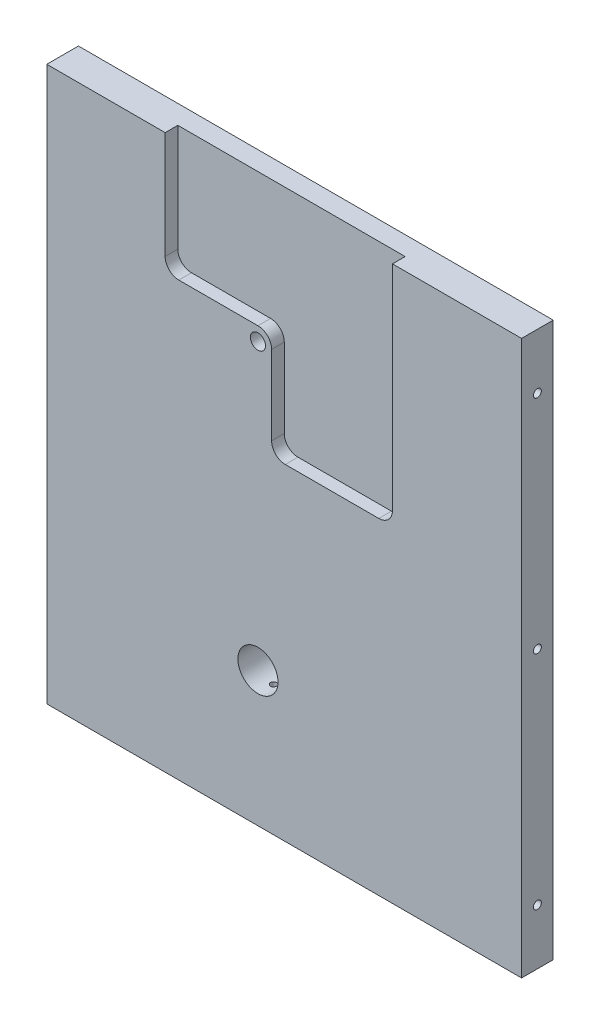
ISO-10303-21;
HEADER;
FILE_DESCRIPTION(('STEP AP214'),'2;1');
FILE_NAME('part.step','',(''),(''),'','','');
FILE_SCHEMA(('AUTOMOTIVE_DESIGN { 1 0 10303 214 1 1 1 1 }'));
ENDSEC;
DATA;
#1=APPLICATION_CONTEXT('core data for automotive mechanical design processes');
#2=APPLICATION_PROTOCOL_DEFINITION('international standard','automotive_design',2000,#1);
#3=PRODUCT_CONTEXT('',#1,'mechanical');
#4=PRODUCT('Part','Part','',(#3));
#5=PRODUCT_RELATED_PRODUCT_CATEGORY('part','',(#4));
#6=PRODUCT_DEFINITION_FORMATION('','',#4);
#7=PRODUCT_DEFINITION_CONTEXT('part definition',#1,'design');
#8=PRODUCT_DEFINITION('design','',#6,#7);
#9=PRODUCT_DEFINITION_SHAPE('','',#8);
#10=(LENGTH_UNIT() NAMED_UNIT(*) SI_UNIT(.MILLI.,.METRE.));
#11=(NAMED_UNIT(*) PLANE_ANGLE_UNIT() SI_UNIT($,.RADIAN.));
#12=(NAMED_UNIT(*) SI_UNIT($,.STERADIAN.) SOLID_ANGLE_UNIT());
#13=UNCERTAINTY_MEASURE_WITH_UNIT(LENGTH_MEASURE(1.E-05),#10,'distance_accuracy_value','');
#14=(GEOMETRIC_REPRESENTATION_CONTEXT(3) GLOBAL_UNCERTAINTY_ASSIGNED_CONTEXT((#13)) GLOBAL_UNIT_ASSIGNED_CONTEXT((#10,
#11,#12)) REPRESENTATION_CONTEXT('',''));
#15=CARTESIAN_POINT('',(0.,0.,0.));
#16=DIRECTION('',(0.,0.,1.));
#17=DIRECTION('',(1.,0.,0.));
#18=AXIS2_PLACEMENT_3D('',#15,#16,#17);
#19=CARTESIAN_POINT('',(-96.1409476965305,69.4002341533426,10.));
#20=DIRECTION('',(1.,0.,0.));
#21=DIRECTION('',(0.,1.,0.));
#22=AXIS2_PLACEMENT_3D('',#19,#20,#21);
#23=PLANE('',#22);
#24=CARTESIAN_POINT('',(-96.1409476965305,51.9002341533426,4.99999999999999));
#25=DIRECTION('',(-1.,0.,0.));
#26=DIRECTION('',(0.,-1.,0.));
#27=AXIS2_PLACEMENT_3D('',#24,#25,#26);
#28=CIRCLE('',#27,1.25);
#29=CARTESIAN_POINT('',(-96.1409476965305,50.6502341533426,4.99999999999999));
#30=VERTEX_POINT('',#29);
#31=EDGE_CURVE('E327',#30,#30,#28,.T.);
#32=ORIENTED_EDGE('',*,*,#31,.F.);
#33=EDGE_LOOP('',(#32));
#34=FACE_BOUND('',#33,.T.);
#35=CARTESIAN_POINT('',(-96.1409476965304,-18.0997658466574,5.));
#36=DIRECTION('',(-1.,0.,0.));
#37=DIRECTION('',(0.,-1.,0.));
#38=AXIS2_PLACEMENT_3D('',#35,#36,#37);
#39=CIRCLE('',#38,1.25);
#40=CARTESIAN_POINT('',(-96.1409476965304,-19.3497658466574,5.));
#41=VERTEX_POINT('',#40);
#42=EDGE_CURVE('E331',#41,#41,#39,.T.);
#43=ORIENTED_EDGE('',*,*,#42,.F.);
#44=EDGE_LOOP('',(#43));
#45=FACE_BOUND('',#44,.T.);
#46=CARTESIAN_POINT('',(-96.1409476965304,-88.0997658466574,4.99999999999999));
#47=DIRECTION('',(-1.,0.,0.));
#48=DIRECTION('',(0.,-1.,0.));
#49=AXIS2_PLACEMENT_3D('',#46,#47,#48);
#50=CIRCLE('',#49,1.25);
#51=CARTESIAN_POINT('',(-96.1409476965304,-89.3497658466574,4.99999999999999));
#52=VERTEX_POINT('',#51);
#53=EDGE_CURVE('E174',#52,#52,#50,.T.);
#54=ORIENTED_EDGE('',*,*,#53,.F.);
#55=EDGE_LOOP('',(#54));
#56=FACE_BOUND('',#55,.T.);
#57=DIRECTION('',(0.,-1.,0.));
#58=VECTOR('',#57,1.);
#59=CARTESIAN_POINT('',(-96.1409476965305,69.4002341533426,0.));
#60=LINE('',#59,#58);
#61=CARTESIAN_POINT('',(-96.1409476965305,69.4002341533426,0.));
#62=VERTEX_POINT('',#61);
#63=CARTESIAN_POINT('',(-96.1409476965304,-105.599765846657,0.));
#64=VERTEX_POINT('',#63);
#65=EDGE_CURVE('E238',#62,#64,#60,.T.);
#66=ORIENTED_EDGE('',*,*,#65,.T.);
#67=DIRECTION('',(0.,0.,-1.));
#68=VECTOR('',#67,1.);
#69=CARTESIAN_POINT('',(-96.1409476965304,-105.599765846657,10.));
#70=LINE('',#69,#68);
#71=CARTESIAN_POINT('',(-96.1409476965304,-105.599765846657,10.));
#72=VERTEX_POINT('',#71);
#73=EDGE_CURVE('E11',#72,#64,#70,.T.);
#74=ORIENTED_EDGE('',*,*,#73,.F.);
#75=DIRECTION('',(0.,-1.,0.));
#76=VECTOR('',#75,1.);
#77=CARTESIAN_POINT('',(-96.1409476965305,69.4002341533426,10.));
#78=LINE('',#77,#76);
#79=CARTESIAN_POINT('',(-96.1409476965305,69.4002341533426,10.));
#80=VERTEX_POINT('',#79);
#81=EDGE_CURVE('E247',#80,#72,#78,.T.);
#82=ORIENTED_EDGE('',*,*,#81,.F.);
#83=DIRECTION('',(0.,0.,-1.));
#84=VECTOR('',#83,1.);
#85=CARTESIAN_POINT('',(-96.1409476965305,69.4002341533426,10.));
#86=LINE('',#85,#84);
#87=EDGE_CURVE('E255',#80,#62,#86,.T.);
#88=ORIENTED_EDGE('',*,*,#87,.T.);
#89=EDGE_LOOP('',(#66,#74,#82,#88));
#90=FACE_BOUND('',#89,.T.);
#91=ADVANCED_FACE('F32',(#34,#45,#56,#90),#23,.F.);
#92=CARTESIAN_POINT('',(-96.1409476965304,-105.599765846657,10.));
#93=DIRECTION('',(0.,1.,0.));
#94=DIRECTION('',(0.,0.,1.));
#95=AXIS2_PLACEMENT_3D('',#92,#93,#94);
#96=PLANE('',#95);
#97=CARTESIAN_POINT('',(-29.4209476965304,-105.599765846657,5.));
#98=DIRECTION('',(0.,-1.,0.));
#99=DIRECTION('',(0.,0.,-1.));
#100=AXIS2_PLACEMENT_3D('',#97,#98,#99);
#101=CIRCLE('',#100,0.999999999999998);
#102=CARTESIAN_POINT('',(-29.4209476965304,-105.599765846657,4.));
#103=VERTEX_POINT('',#102);
#104=EDGE_CURVE('E347',#103,#103,#101,.T.);
#105=ORIENTED_EDGE('',*,*,#104,.F.);
#106=EDGE_LOOP('',(#105));
#107=FACE_BOUND('',#106,.T.);
#108=DIRECTION('',(1.,0.,0.));
#109=VECTOR('',#108,1.);
#110=CARTESIAN_POINT('',(-96.1409476965304,-105.599765846657,0.));
#111=LINE('',#110,#109);
#112=CARTESIAN_POINT('',(53.8590523034696,-105.599765846657,0.));
#113=VERTEX_POINT('',#112);
#114=EDGE_CURVE('E258',#64,#113,#111,.T.);
#115=ORIENTED_EDGE('',*,*,#114,.T.);
#116=DIRECTION('',(0.,0.,-1.));
#117=VECTOR('',#116,1.);
#118=CARTESIAN_POINT('',(53.8590523034696,-105.599765846657,10.));
#119=LINE('',#118,#117);
#120=CARTESIAN_POINT('',(53.8590523034696,-105.599765846657,10.));
#121=VERTEX_POINT('',#120);
#122=EDGE_CURVE('E45',#121,#113,#119,.T.);
#123=ORIENTED_EDGE('',*,*,#122,.F.);
#124=DIRECTION('',(1.,0.,0.));
#125=VECTOR('',#124,1.);
#126=CARTESIAN_POINT('',(-96.1409476965304,-105.599765846657,10.));
#127=LINE('',#126,#125);
#128=EDGE_CURVE('E90',#72,#121,#127,.T.);
#129=ORIENTED_EDGE('',*,*,#128,.F.);
#130=ORIENTED_EDGE('',*,*,#73,.T.);
#131=EDGE_LOOP('',(#115,#123,#129,#130));
#132=FACE_BOUND('',#131,.T.);
#133=ADVANCED_FACE('F318',(#107,#132),#96,.F.);
#134=CARTESIAN_POINT('',(53.8590523034695,69.4002341533426,10.));
#135=DIRECTION('',(-1.,0.,0.));
#136=DIRECTION('',(0.,-1.,0.));
#137=AXIS2_PLACEMENT_3D('',#134,#135,#136);
#138=PLANE('',#137);
#139=CARTESIAN_POINT('',(53.8590523034695,51.9002341533426,5.));
#140=DIRECTION('',(1.,0.,0.));
#141=DIRECTION('',(0.,1.,0.));
#142=AXIS2_PLACEMENT_3D('',#139,#140,#141);
#143=CIRCLE('',#142,1.25);
#144=CARTESIAN_POINT('',(53.8590523034695,53.1502341533426,5.));
#145=VERTEX_POINT('',#144);
#146=EDGE_CURVE('E339',#145,#145,#143,.T.);
#147=ORIENTED_EDGE('',*,*,#146,.F.);
#148=EDGE_LOOP('',(#147));
#149=FACE_BOUND('',#148,.T.);
#150=CARTESIAN_POINT('',(53.8590523034695,-18.0997658466574,5.));
#151=DIRECTION('',(1.,0.,0.));
#152=DIRECTION('',(0.,1.,0.));
#153=AXIS2_PLACEMENT_3D('',#150,#151,#152);
#154=CIRCLE('',#153,1.25);
#155=CARTESIAN_POINT('',(53.8590523034695,-16.8497658466574,5.));
#156=VERTEX_POINT('',#155);
#157=EDGE_CURVE('E351',#156,#156,#154,.T.);
#158=ORIENTED_EDGE('',*,*,#157,.F.);
#159=EDGE_LOOP('',(#158));
#160=FACE_BOUND('',#159,.T.);
#161=CARTESIAN_POINT('',(53.8590523034696,-88.0997658466574,5.));
#162=DIRECTION('',(1.,0.,0.));
#163=DIRECTION('',(0.,1.,0.));
#164=AXIS2_PLACEMENT_3D('',#161,#162,#163);
#165=CIRCLE('',#164,1.25);
#166=CARTESIAN_POINT('',(53.8590523034696,-86.8497658466574,5.));
#167=VERTEX_POINT('',#166);
#168=EDGE_CURVE('E357',#167,#167,#165,.T.);
#169=ORIENTED_EDGE('',*,*,#168,.F.);
#170=EDGE_LOOP('',(#169));
#171=FACE_BOUND('',#170,.T.);
#172=DIRECTION('',(0.,1.,0.));
#173=VECTOR('',#172,1.);
#174=CARTESIAN_POINT('',(53.8590523034695,69.4002341533426,0.));
#175=LINE('',#174,#173);
#176=CARTESIAN_POINT('',(53.8590523034695,69.4002341533426,0.));
#177=VERTEX_POINT('',#176);
#178=EDGE_CURVE('E260',#113,#177,#175,.T.);
#179=ORIENTED_EDGE('',*,*,#178,.T.);
#180=DIRECTION('',(0.,0.,-1.));
#181=VECTOR('',#180,1.);
#182=CARTESIAN_POINT('',(53.8590523034695,69.4002341533426,10.));
#183=LINE('',#182,#181);
#184=CARTESIAN_POINT('',(53.8590523034695,69.4002341533426,10.));
#185=VERTEX_POINT('',#184);
#186=EDGE_CURVE('E264',#185,#177,#183,.T.);
#187=ORIENTED_EDGE('',*,*,#186,.F.);
#188=DIRECTION('',(0.,1.,0.));
#189=VECTOR('',#188,1.);
#190=CARTESIAN_POINT('',(53.8590523034695,69.4002341533426,10.));
#191=LINE('',#190,#189);
#192=EDGE_CURVE('E250',#121,#185,#191,.T.);
#193=ORIENTED_EDGE('',*,*,#192,.F.);
#194=ORIENTED_EDGE('',*,*,#122,.T.);
#195=EDGE_LOOP('',(#179,#187,#193,#194));
#196=FACE_BOUND('',#195,.T.);
#197=ADVANCED_FACE('F270',(#149,#160,#171,#196),#138,.F.);
#198=CARTESIAN_POINT('',(-96.1409476965305,69.4002341533426,10.));
#199=DIRECTION('',(0.,-1.,0.));
#200=DIRECTION('',(0.,0.,-1.));
#201=AXIS2_PLACEMENT_3D('',#198,#199,#200);
#202=PLANE('',#201);
#203=DIRECTION('',(-1.,0.,0.));
#204=VECTOR('',#203,1.);
#205=CARTESIAN_POINT('',(-96.1409476965305,69.4002341533426,10.));
#206=LINE('',#205,#204);
#207=CARTESIAN_POINT('',(-58.7437041134573,69.4002341533426,10.));
#208=VERTEX_POINT('',#207);
#209=EDGE_CURVE('E61',#208,#80,#206,.T.);
#210=ORIENTED_EDGE('',*,*,#209,.F.);
#211=DIRECTION('',(0.,0.,1.));
#212=VECTOR('',#211,1.);
#213=CARTESIAN_POINT('',(-58.7437041134573,69.4002341533426,6.));
#214=LINE('',#213,#212);
#215=CARTESIAN_POINT('',(-58.7437041134573,69.4002341533426,6.));
#216=VERTEX_POINT('',#215);
#217=EDGE_CURVE('E219',#216,#208,#214,.T.);
#218=ORIENTED_EDGE('',*,*,#217,.F.);
#219=DIRECTION('',(-1.,0.,0.));
#220=VECTOR('',#219,1.);
#221=CARTESIAN_POINT('',(-58.7437041134573,69.4002341533426,6.));
#222=LINE('',#221,#220);
#223=CARTESIAN_POINT('',(13.0742958865426,69.4002341533426,6.));
#224=VERTEX_POINT('',#223);
#225=EDGE_CURVE('E193',#224,#216,#222,.T.);
#226=ORIENTED_EDGE('',*,*,#225,.F.);
#227=DIRECTION('',(0.,0.,1.));
#228=VECTOR('',#227,1.);
#229=CARTESIAN_POINT('',(13.0742958865426,69.4002341533426,6.));
#230=LINE('',#229,#228);
#231=CARTESIAN_POINT('',(13.0742958865426,69.4002341533426,10.));
#232=VERTEX_POINT('',#231);
#233=EDGE_CURVE('E221',#224,#232,#230,.T.);
#234=ORIENTED_EDGE('',*,*,#233,.T.);
#235=EDGE_CURVE('E252',#185,#232,#206,.T.);
#236=ORIENTED_EDGE('',*,*,#235,.F.);
#237=ORIENTED_EDGE('',*,*,#186,.T.);
#238=DIRECTION('',(-1.,0.,0.));
#239=VECTOR('',#238,1.);
#240=CARTESIAN_POINT('',(-96.1409476965305,69.4002341533426,0.));
#241=LINE('',#240,#239);
#242=EDGE_CURVE('E83',#177,#62,#241,.T.);
#243=ORIENTED_EDGE('',*,*,#242,.T.);
#244=ORIENTED_EDGE('',*,*,#87,.F.);
#245=EDGE_LOOP('',(#210,#218,#226,#234,#236,#237,#243,#244));
#246=FACE_BOUND('',#245,.T.);
#247=ADVANCED_FACE('F278',(#246),#202,.F.);
#248=CARTESIAN_POINT('',(0.,0.,10.));
#249=DIRECTION('',(0.,0.,1.));
#250=DIRECTION('',(1.,0.,0.));
#251=AXIS2_PLACEMENT_3D('',#248,#249,#250);
#252=PLANE('',#251);
#253=DIRECTION('',(0.,-1.,0.));
#254=VECTOR('',#253,1.);
#255=CARTESIAN_POINT('',(-58.7437041134574,35.5362341533427,10.));
#256=LINE('',#255,#254);
#257=CARTESIAN_POINT('',(-58.7437041134574,35.5362341533427,10.));
#258=VERTEX_POINT('',#257);
#259=EDGE_CURVE('E168',#208,#258,#256,.T.);
#260=ORIENTED_EDGE('',*,*,#259,.F.);
#261=ORIENTED_EDGE('',*,*,#209,.T.);
#262=ORIENTED_EDGE('',*,*,#81,.T.);
#263=ORIENTED_EDGE('',*,*,#128,.T.);
#264=ORIENTED_EDGE('',*,*,#192,.T.);
#265=ORIENTED_EDGE('',*,*,#235,.T.);
#266=DIRECTION('',(0.,1.,0.));
#267=VECTOR('',#266,1.);
#268=CARTESIAN_POINT('',(13.0742958865426,1.90023415334267,10.));
#269=LINE('',#268,#267);
#270=CARTESIAN_POINT('',(13.0742958865426,1.90023415334267,10.));
#271=VERTEX_POINT('',#270);
#272=EDGE_CURVE('E171',#271,#232,#269,.T.);
#273=ORIENTED_EDGE('',*,*,#272,.F.);
#274=CARTESIAN_POINT('',(8.75629588654262,1.90023415334267,10.));
#275=DIRECTION('',(0.,0.,1.));
#276=DIRECTION('',(1.,0.,0.));
#277=AXIS2_PLACEMENT_3D('',#274,#275,#276);
#278=CIRCLE('',#277,4.318);
#279=CARTESIAN_POINT('',(8.75629588654262,-2.41776584665733,10.));
#280=VERTEX_POINT('',#279);
#281=EDGE_CURVE('E212',#280,#271,#278,.T.);
#282=ORIENTED_EDGE('',*,*,#281,.F.);
#283=DIRECTION('',(1.,0.,0.));
#284=VECTOR('',#283,1.);
#285=CARTESIAN_POINT('',(-20.7897041134574,-2.41776584665733,10.));
#286=LINE('',#285,#284);
#287=CARTESIAN_POINT('',(-20.7897041134574,-2.41776584665733,10.));
#288=VERTEX_POINT('',#287);
#289=EDGE_CURVE('E209',#288,#280,#286,.T.);
#290=ORIENTED_EDGE('',*,*,#289,.F.);
#291=CARTESIAN_POINT('',(-20.7897041134574,1.90023415334267,10.));
#292=DIRECTION('',(0.,0.,1.));
#293=DIRECTION('',(1.,0.,0.));
#294=AXIS2_PLACEMENT_3D('',#291,#292,#293);
#295=CIRCLE('',#294,4.318);
#296=CARTESIAN_POINT('',(-25.1077041134573,1.90023415334267,10.));
#297=VERTEX_POINT('',#296);
#298=EDGE_CURVE('E206',#297,#288,#295,.T.);
#299=ORIENTED_EDGE('',*,*,#298,.F.);
#300=DIRECTION('',(0.,-1.,0.));
#301=VECTOR('',#300,1.);
#302=CARTESIAN_POINT('',(-25.1077041134574,26.9002341533427,10.));
#303=LINE('',#302,#301);
#304=CARTESIAN_POINT('',(-25.1077041134574,26.9002341533427,10.));
#305=VERTEX_POINT('',#304);
#306=EDGE_CURVE('E203',#305,#297,#303,.T.);
#307=ORIENTED_EDGE('',*,*,#306,.F.);
#308=CARTESIAN_POINT('',(-29.4257041134573,26.9002341533427,10.));
#309=DIRECTION('',(0.,0.,-1.));
#310=DIRECTION('',(-1.,0.,0.));
#311=AXIS2_PLACEMENT_3D('',#308,#309,#310);
#312=CIRCLE('',#311,4.318);
#313=CARTESIAN_POINT('',(-29.4257041134573,31.2182341533427,10.));
#314=VERTEX_POINT('',#313);
#315=EDGE_CURVE('E200',#314,#305,#312,.T.);
#316=ORIENTED_EDGE('',*,*,#315,.F.);
#317=DIRECTION('',(1.,0.,0.));
#318=VECTOR('',#317,1.);
#319=CARTESIAN_POINT('',(-54.4257041134573,31.2182341533427,10.));
#320=LINE('',#319,#318);
#321=CARTESIAN_POINT('',(-54.4257041134573,31.2182341533427,10.));
#322=VERTEX_POINT('',#321);
#323=EDGE_CURVE('E197',#322,#314,#320,.T.);
#324=ORIENTED_EDGE('',*,*,#323,.F.);
#325=CARTESIAN_POINT('',(-54.4257041134573,35.5362341533427,10.));
#326=DIRECTION('',(0.,0.,1.));
#327=DIRECTION('',(-1.,0.,0.));
#328=AXIS2_PLACEMENT_3D('',#325,#326,#327);
#329=CIRCLE('',#328,4.318);
#330=EDGE_CURVE('E52',#258,#322,#329,.T.);
#331=ORIENTED_EDGE('',*,*,#330,.F.);
#332=EDGE_LOOP('',(#260,#261,#262,#263,#264,#265,#273,#282,#290,#299,#307,#316,#324,#331));
#333=FACE_BOUND('',#332,.T.);
#334=CARTESIAN_POINT('',(-29.4257041134573,26.9002341533427,10.));
#335=DIRECTION('',(0.,0.,1.));
#336=DIRECTION('',(1.,0.,0.));
#337=AXIS2_PLACEMENT_3D('',#334,#335,#336);
#338=CIRCLE('',#337,2.3876);
#339=CARTESIAN_POINT('',(-27.0381041134574,26.9002341533427,10.));
#340=VERTEX_POINT('',#339);
#341=EDGE_CURVE('E239',#340,#340,#338,.T.);
#342=ORIENTED_EDGE('',*,*,#341,.F.);
#343=EDGE_LOOP('',(#342));
#344=FACE_BOUND('',#343,.T.);
#345=CARTESIAN_POINT('',(-29.4257041134573,-63.0997658466573,10.));
#346=DIRECTION('',(0.,0.,1.));
#347=DIRECTION('',(1.,0.,0.));
#348=AXIS2_PLACEMENT_3D('',#345,#346,#347);
#349=CIRCLE('',#348,6.335);
#350=CARTESIAN_POINT('',(-23.0907041134574,-63.0997658466573,10.));
#351=VERTEX_POINT('',#350);
#352=EDGE_CURVE('E218',#351,#351,#349,.T.);
#353=ORIENTED_EDGE('',*,*,#352,.F.);
#354=EDGE_LOOP('',(#353));
#355=FACE_BOUND('',#354,.T.);
#356=ADVANCED_FACE('F283',(#333,#344,#355),#252,.T.);
#357=CARTESIAN_POINT('',(0.,0.,0.));
#358=DIRECTION('',(0.,0.,1.));
#359=DIRECTION('',(1.,0.,0.));
#360=AXIS2_PLACEMENT_3D('',#357,#358,#359);
#361=PLANE('',#360);
#362=CARTESIAN_POINT('',(-29.4257041134573,26.9002341533427,0.));
#363=DIRECTION('',(0.,0.,1.));
#364=DIRECTION('',(1.,0.,0.));
#365=AXIS2_PLACEMENT_3D('',#362,#363,#364);
#366=CIRCLE('',#365,2.3876);
#367=CARTESIAN_POINT('',(-27.0381041134574,26.9002341533427,0.));
#368=VERTEX_POINT('',#367);
#369=EDGE_CURVE('E235',#368,#368,#366,.T.);
#370=ORIENTED_EDGE('',*,*,#369,.T.);
#371=EDGE_LOOP('',(#370));
#372=FACE_BOUND('',#371,.T.);
#373=CARTESIAN_POINT('',(-29.4257041134573,-63.0997658466573,0.));
#374=DIRECTION('',(0.,0.,1.));
#375=DIRECTION('',(1.,0.,0.));
#376=AXIS2_PLACEMENT_3D('',#373,#374,#375);
#377=CIRCLE('',#376,6.335);
#378=CARTESIAN_POINT('',(-23.0907041134574,-63.0997658466573,0.));
#379=VERTEX_POINT('',#378);
#380=EDGE_CURVE('E242',#379,#379,#377,.T.);
#381=ORIENTED_EDGE('',*,*,#380,.T.);
#382=EDGE_LOOP('',(#381));
#383=FACE_BOUND('',#382,.T.);
#384=ORIENTED_EDGE('',*,*,#65,.F.);
#385=ORIENTED_EDGE('',*,*,#242,.F.);
#386=ORIENTED_EDGE('',*,*,#178,.F.);
#387=ORIENTED_EDGE('',*,*,#114,.F.);
#388=EDGE_LOOP('',(#384,#385,#386,#387));
#389=FACE_BOUND('',#388,.T.);
#390=ADVANCED_FACE('F274',(#372,#383,#389),#361,.F.);
#391=CARTESIAN_POINT('',(-29.4257041134573,-63.0997658466573,0.));
#392=DIRECTION('',(0.,0.,1.));
#393=DIRECTION('',(1.,0.,0.));
#394=AXIS2_PLACEMENT_3D('',#391,#392,#393);
#395=CYLINDRICAL_SURFACE('',#394,6.335);
#396=CARTESIAN_POINT('',(-29.4209476965304,-69.434764061061,4.));
#397=CARTESIAN_POINT('',(-29.3651450263647,-69.4347212376575,4.00000227428696));
#398=CARTESIAN_POINT('',(-29.3093113913262,-69.4339352174901,4.00468668421402));
#399=CARTESIAN_POINT('',(-29.1992083404319,-69.4309558270263,4.02329387445628));
#400=CARTESIAN_POINT('',(-29.1449404621475,-69.4287611194692,4.03722543347842));
#401=CARTESIAN_POINT('',(-29.0395780103241,-69.4232074164402,4.07389776069376));
#402=CARTESIAN_POINT('',(-28.9884809737087,-69.4198493383566,4.09663158941962));
#403=CARTESIAN_POINT('',(-28.8908344007046,-69.412335895894,4.15024556618108));
#404=CARTESIAN_POINT('',(-28.8442842846785,-69.4081806333401,4.18112467400148));
#405=CARTESIAN_POINT('',(-28.7566424327718,-69.3994911352459,4.25043759082029));
#406=CARTESIAN_POINT('',(-28.715595802134,-69.39495421189,4.28892810195437));
#407=CARTESIAN_POINT('',(-28.6405156715602,-69.3860315954243,4.37224922682342));
#408=CARTESIAN_POINT('',(-28.6064825919686,-69.3816459113918,4.41708022029234));
#409=CARTESIAN_POINT('',(-28.5462202167404,-69.3734940892441,4.5121123730229));
#410=CARTESIAN_POINT('',(-28.5200344239045,-69.3697314547615,4.56234144499089));
#411=CARTESIAN_POINT('',(-28.476488650512,-69.3632874258886,4.66655479698262));
#412=CARTESIAN_POINT('',(-28.4591281297886,-69.3606059653252,4.72053884694613));
#413=CARTESIAN_POINT('',(-28.4338677341149,-69.3566539963207,4.83024978802421));
#414=CARTESIAN_POINT('',(-28.4258897238246,-69.3553718413422,4.8859582616869));
#415=CARTESIAN_POINT('',(-28.4193786010109,-69.3543278245273,4.99793682679073));
#416=CARTESIAN_POINT('',(-28.4208448836974,-69.3545658653411,5.05420688203911));
#417=CARTESIAN_POINT('',(-28.4331172806647,-69.356524853772,5.16515980174996));
#418=CARTESIAN_POINT('',(-28.4438365251626,-69.3582320084199,5.21985255350174));
#419=CARTESIAN_POINT('',(-28.4741744148995,-69.3629159917552,5.32665326671305));
#420=CARTESIAN_POINT('',(-28.4937933376744,-69.3658928600383,5.37876114750731));
#421=CARTESIAN_POINT('',(-28.5414629074817,-69.3727971768165,5.47917535923359));
#422=CARTESIAN_POINT('',(-28.5695500170163,-69.3767287214378,5.52746408717513));
#423=CARTESIAN_POINT('',(-28.633332579446,-69.3850982735874,5.61867597959509));
#424=CARTESIAN_POINT('',(-28.6690285888683,-69.3895363181509,5.66159875123422));
#425=CARTESIAN_POINT('',(-28.7474915496174,-69.3984820310586,5.74136445783751));
#426=CARTESIAN_POINT('',(-28.7903332447911,-69.4029899223525,5.77813388407641));
#427=CARTESIAN_POINT('',(-28.8816175375444,-69.4115241386683,5.84397264998205));
#428=CARTESIAN_POINT('',(-28.930060168034,-69.4155504608603,5.87304194440101));
#429=CARTESIAN_POINT('',(-29.0312414249493,-69.4226761879044,5.92266253036693));
#430=CARTESIAN_POINT('',(-29.0839833863282,-69.4257748643155,5.94320713269338));
#431=CARTESIAN_POINT('',(-29.1922290421965,-69.4306936540924,5.97512620218798));
#432=CARTESIAN_POINT('',(-29.2477325291838,-69.4325138633678,5.98650135725052));
#433=CARTESIAN_POINT('',(-29.3592966059929,-69.4346608316634,5.99966031659868));
#434=CARTESIAN_POINT('',(-29.4153450830892,-69.4350031924427,6.00154435495136));
#435=CARTESIAN_POINT('',(-29.5269582167273,-69.4342024542827,5.99593361796201));
#436=CARTESIAN_POINT('',(-29.5825228901247,-69.4330594073044,5.98843917068853));
#437=CARTESIAN_POINT('',(-29.6912793405321,-69.4294294197818,5.96436818621698));
#438=CARTESIAN_POINT('',(-29.74448245714,-69.4269498817571,5.94784166863897));
#439=CARTESIAN_POINT('',(-29.8473631998057,-69.4209276485853,5.90622807161919));
#440=CARTESIAN_POINT('',(-29.8970406469619,-69.4173848995357,5.88114055814493));
#441=CARTESIAN_POINT('',(-29.9918925444829,-69.409594759832,5.82288762283575));
#442=CARTESIAN_POINT('',(-30.0370282804605,-69.4053420186638,5.78965989263752));
#443=CARTESIAN_POINT('',(-30.121118817866,-69.396623309614,5.71615598204117));
#444=CARTESIAN_POINT('',(-30.1600732197323,-69.3921573279727,5.6758793463552));
#445=CARTESIAN_POINT('',(-30.2310624666881,-69.3834683345674,5.58897431066581));
#446=CARTESIAN_POINT('',(-30.2630300080847,-69.3792479508934,5.54229062887615));
#447=CARTESIAN_POINT('',(-30.3186695987927,-69.3715781674403,5.44415820284489));
#448=CARTESIAN_POINT('',(-30.3423418858307,-69.3681287455678,5.39270959521056));
#449=CARTESIAN_POINT('',(-30.3806186413857,-69.3624121638031,5.28669750478098));
#450=CARTESIAN_POINT('',(-30.3952567903095,-69.3601406177681,5.23214642979928));
#451=CARTESIAN_POINT('',(-30.4151559198876,-69.3570266926261,5.12132149267173));
#452=CARTESIAN_POINT('',(-30.4204176177221,-69.3561842042145,5.0650477626222));
#453=CARTESIAN_POINT('',(-30.4213960755053,-69.3560285002958,4.95304018251748));
#454=CARTESIAN_POINT('',(-30.4172177486328,-69.3566984757216,4.89730724423198));
#455=CARTESIAN_POINT('',(-30.3996605184937,-69.3594552669776,4.78734747334134));
#456=CARTESIAN_POINT('',(-30.3862816356035,-69.3615420796699,4.73312063740091));
#457=CARTESIAN_POINT('',(-30.3507415901905,-69.3668904465581,4.62774674755214));
#458=CARTESIAN_POINT('',(-30.3285885507459,-69.3701509139354,4.57659689529548));
#459=CARTESIAN_POINT('',(-30.276139517243,-69.3774790232899,4.47872275652332));
#460=CARTESIAN_POINT('',(-30.2458431918486,-69.3815466981092,4.43199865018846));
#461=CARTESIAN_POINT('',(-30.1775891087569,-69.3900826870254,4.34377042654392));
#462=CARTESIAN_POINT('',(-30.1395538330889,-69.3945547778999,4.30232663535309));
#463=CARTESIAN_POINT('',(-30.0570651040307,-69.4033620557219,4.22637321878899));
#464=CARTESIAN_POINT('',(-30.0126101704681,-69.4076972108146,4.19186519698815));
#465=CARTESIAN_POINT('',(-29.9182268846647,-69.4157694261892,4.13057521214737));
#466=CARTESIAN_POINT('',(-29.8682671418079,-69.4195027220231,4.10384109581519));
#467=CARTESIAN_POINT('',(-29.7645294748766,-69.4259109969725,4.05918441756129));
#468=CARTESIAN_POINT('',(-29.7107555018462,-69.4285870528987,4.04125288556895));
#469=CARTESIAN_POINT('',(-29.6174531932944,-69.4319804328041,4.01869965840468));
#470=CARTESIAN_POINT('',(-29.5784955413468,-69.433044623519,4.01169818399137));
#471=CARTESIAN_POINT('',(-29.5000130019248,-69.4344516042567,4.00234758261124));
#472=CARTESIAN_POINT('',(-29.4604881226459,-69.4347944046918,3.99999838849512));
#473=CARTESIAN_POINT('',(-29.4209476965304,-69.434764061061,4.));
#474=B_SPLINE_CURVE_WITH_KNOTS('',3,(#396,#397,#398,#399,#400,#401,#402,#403,#404,#405,#406,
#407,#408,#409,#410,#411,#412,#413,#414,#415,#416,#417,#418,#419,#420,#421,#422,#423,#424,#425,
#426,#427,#428,#429,#430,#431,#432,#433,#434,#435,#436,#437,#438,#439,#440,#441,#442,#443,#444,
#445,#446,#447,#448,#449,#450,#451,#452,#453,#454,#455,#456,#457,#458,#459,#460,#461,#462,#463,
#464,#465,#466,#467,#468,#469,#470,#471,#472,#473),.UNSPECIFIED.,.T.,.F.,(4,2,2,2,2,2,2,2,2,2,2,
2,2,2,2,2,2,2,2,2,2,2,2,2,2,2,2,2,2,2,2,2,2,2,2,2,2,2,4),(0.,0.167263535368766,
0.334686088581399,0.501976918332641,0.669246394084501,0.837812394498943,1.00638849467474,
1.17588253674446,1.34536620337435,1.51342822429691,1.68147948303122,1.84796997253611,
2.01446565439473,2.18168873146201,2.34892404369607,2.518033111575,2.68714317315684,
2.85638568350645,3.02561549605563,3.19305429849942,3.36048724393482,3.52700220544459,
3.69352561032311,3.86136582046553,4.02921687538766,4.19861977827843,4.36801782600277,
4.53678045996341,4.70553018515653,4.87241372102312,5.03929688729274,5.2060259135983,
5.37276172484902,5.54125806912611,5.70979332560552,5.87934492897268,6.04872339416321,
6.16724401161338,6.28576291836848),.UNSPECIFIED.);
#475=CARTESIAN_POINT('',(-29.4209476965304,-69.434764061061,4.));
#476=VERTEX_POINT('',#475);
#477=EDGE_CURVE('E35',#476,#476,#474,.T.);
#478=ORIENTED_EDGE('',*,*,#477,.T.);
#479=EDGE_LOOP('',(#478));
#480=FACE_BOUND('',#479,.T.);
#481=ORIENTED_EDGE('',*,*,#380,.F.);
#482=EDGE_LOOP('',(#481));
#483=FACE_BOUND('',#482,.T.);
#484=ORIENTED_EDGE('',*,*,#352,.T.);
#485=EDGE_LOOP('',(#484));
#486=FACE_BOUND('',#485,.T.);
#487=ADVANCED_FACE('F404',(#480,#483,#486),#395,.F.);
#488=CARTESIAN_POINT('',(-29.4257041134573,26.9002341533427,0.));
#489=DIRECTION('',(0.,0.,1.));
#490=DIRECTION('',(1.,0.,0.));
#491=AXIS2_PLACEMENT_3D('',#488,#489,#490);
#492=CYLINDRICAL_SURFACE('',#491,2.3876);
#493=ORIENTED_EDGE('',*,*,#369,.F.);
#494=EDGE_LOOP('',(#493));
#495=FACE_BOUND('',#494,.T.);
#496=ORIENTED_EDGE('',*,*,#341,.T.);
#497=EDGE_LOOP('',(#496));
#498=FACE_BOUND('',#497,.T.);
#499=ADVANCED_FACE('F402',(#495,#498),#492,.F.);
#500=CARTESIAN_POINT('',(-54.4257041134573,35.5362341533427,6.));
#501=DIRECTION('',(0.,0.,1.));
#502=DIRECTION('',(1.,0.,0.));
#503=AXIS2_PLACEMENT_3D('',#500,#501,#502);
#504=CYLINDRICAL_SURFACE('',#503,4.318);
#505=ORIENTED_EDGE('',*,*,#330,.T.);
#506=DIRECTION('',(0.,0.,1.));
#507=VECTOR('',#506,1.);
#508=CARTESIAN_POINT('',(-54.4257041134573,31.2182341533427,6.));
#509=LINE('',#508,#507);
#510=CARTESIAN_POINT('',(-54.4257041134573,31.2182341533427,6.));
#511=VERTEX_POINT('',#510);
#512=EDGE_CURVE('E146',#511,#322,#509,.T.);
#513=ORIENTED_EDGE('',*,*,#512,.F.);
#514=CARTESIAN_POINT('',(-54.4257041134573,35.5362341533427,6.));
#515=DIRECTION('',(0.,0.,1.));
#516=DIRECTION('',(-1.,0.,0.));
#517=AXIS2_PLACEMENT_3D('',#514,#515,#516);
#518=CIRCLE('',#517,4.318);
#519=CARTESIAN_POINT('',(-58.7437041134574,35.5362341533427,6.));
#520=VERTEX_POINT('',#519);
#521=EDGE_CURVE('E150',#520,#511,#518,.T.);
#522=ORIENTED_EDGE('',*,*,#521,.F.);
#523=DIRECTION('',(0.,0.,1.));
#524=VECTOR('',#523,1.);
#525=CARTESIAN_POINT('',(-58.7437041134574,35.5362341533427,6.));
#526=LINE('',#525,#524);
#527=EDGE_CURVE('E216',#520,#258,#526,.T.);
#528=ORIENTED_EDGE('',*,*,#527,.T.);
#529=EDGE_LOOP('',(#505,#513,#522,#528));
#530=FACE_BOUND('',#529,.T.);
#531=ADVANCED_FACE('F148',(#530),#504,.F.);
#532=CARTESIAN_POINT('',(-58.7437041134574,35.5362341533427,6.));
#533=DIRECTION('',(-1.,0.,0.));
#534=DIRECTION('',(0.,-1.,0.));
#535=AXIS2_PLACEMENT_3D('',#532,#533,#534);
#536=PLANE('',#535);
#537=ORIENTED_EDGE('',*,*,#259,.T.);
#538=ORIENTED_EDGE('',*,*,#527,.F.);
#539=DIRECTION('',(0.,-1.,0.));
#540=VECTOR('',#539,1.);
#541=CARTESIAN_POINT('',(-58.7437041134574,35.5362341533427,6.));
#542=LINE('',#541,#540);
#543=EDGE_CURVE('E156',#216,#520,#542,.T.);
#544=ORIENTED_EDGE('',*,*,#543,.F.);
#545=ORIENTED_EDGE('',*,*,#217,.T.);
#546=EDGE_LOOP('',(#537,#538,#544,#545));
#547=FACE_BOUND('',#546,.T.);
#548=ADVANCED_FACE('F282',(#547),#536,.F.);
#549=CARTESIAN_POINT('',(13.0742958865426,1.90023415334267,6.));
#550=DIRECTION('',(1.,0.,0.));
#551=DIRECTION('',(0.,0.,-1.));
#552=AXIS2_PLACEMENT_3D('',#549,#550,#551);
#553=PLANE('',#552);
#554=ORIENTED_EDGE('',*,*,#272,.T.);
#555=ORIENTED_EDGE('',*,*,#233,.F.);
#556=DIRECTION('',(0.,1.,0.));
#557=VECTOR('',#556,1.);
#558=CARTESIAN_POINT('',(13.0742958865426,1.90023415334267,6.));
#559=LINE('',#558,#557);
#560=CARTESIAN_POINT('',(13.0742958865426,1.90023415334267,6.));
#561=VERTEX_POINT('',#560);
#562=EDGE_CURVE('E190',#561,#224,#559,.T.);
#563=ORIENTED_EDGE('',*,*,#562,.F.);
#564=DIRECTION('',(0.,0.,1.));
#565=VECTOR('',#564,1.);
#566=CARTESIAN_POINT('',(13.0742958865426,1.90023415334267,6.));
#567=LINE('',#566,#565);
#568=EDGE_CURVE('E224',#561,#271,#567,.T.);
#569=ORIENTED_EDGE('',*,*,#568,.T.);
#570=EDGE_LOOP('',(#554,#555,#563,#569));
#571=FACE_BOUND('',#570,.T.);
#572=ADVANCED_FACE('F307',(#571),#553,.F.);
#573=CARTESIAN_POINT('',(8.75629588654262,1.90023415334267,6.));
#574=DIRECTION('',(0.,0.,1.));
#575=DIRECTION('',(1.,0.,0.));
#576=AXIS2_PLACEMENT_3D('',#573,#574,#575);
#577=CYLINDRICAL_SURFACE('',#576,4.318);
#578=ORIENTED_EDGE('',*,*,#281,.T.);
#579=ORIENTED_EDGE('',*,*,#568,.F.);
#580=CARTESIAN_POINT('',(8.75629588654262,1.90023415334267,6.));
#581=DIRECTION('',(0.,0.,1.));
#582=DIRECTION('',(1.,0.,0.));
#583=AXIS2_PLACEMENT_3D('',#580,#581,#582);
#584=CIRCLE('',#583,4.318);
#585=CARTESIAN_POINT('',(8.75629588654262,-2.41776584665733,6.));
#586=VERTEX_POINT('',#585);
#587=EDGE_CURVE('E187',#586,#561,#584,.T.);
#588=ORIENTED_EDGE('',*,*,#587,.F.);
#589=DIRECTION('',(0.,0.,1.));
#590=VECTOR('',#589,1.);
#591=CARTESIAN_POINT('',(8.75629588654262,-2.41776584665733,6.));
#592=LINE('',#591,#590);
#593=EDGE_CURVE('E226',#586,#280,#592,.T.);
#594=ORIENTED_EDGE('',*,*,#593,.T.);
#595=EDGE_LOOP('',(#578,#579,#588,#594));
#596=FACE_BOUND('',#595,.T.);
#597=ADVANCED_FACE('F303',(#596),#577,.F.);
#598=CARTESIAN_POINT('',(-20.7897041134574,-2.41776584665733,6.));
#599=DIRECTION('',(0.,-1.,0.));
#600=DIRECTION('',(0.,0.,-1.));
#601=AXIS2_PLACEMENT_3D('',#598,#599,#600);
#602=PLANE('',#601);
#603=ORIENTED_EDGE('',*,*,#289,.T.);
#604=ORIENTED_EDGE('',*,*,#593,.F.);
#605=DIRECTION('',(1.,0.,0.));
#606=VECTOR('',#605,1.);
#607=CARTESIAN_POINT('',(-20.7897041134574,-2.41776584665733,6.));
#608=LINE('',#607,#606);
#609=CARTESIAN_POINT('',(-20.7897041134574,-2.41776584665733,6.));
#610=VERTEX_POINT('',#609);
#611=EDGE_CURVE('E184',#610,#586,#608,.T.);
#612=ORIENTED_EDGE('',*,*,#611,.F.);
#613=DIRECTION('',(0.,0.,1.));
#614=VECTOR('',#613,1.);
#615=CARTESIAN_POINT('',(-20.7897041134574,-2.41776584665733,6.));
#616=LINE('',#615,#614);
#617=EDGE_CURVE('E228',#610,#288,#616,.T.);
#618=ORIENTED_EDGE('',*,*,#617,.T.);
#619=EDGE_LOOP('',(#603,#604,#612,#618));
#620=FACE_BOUND('',#619,.T.);
#621=ADVANCED_FACE('F299',(#620),#602,.F.);
#622=CARTESIAN_POINT('',(-20.7897041134574,1.90023415334267,6.));
#623=DIRECTION('',(0.,0.,1.));
#624=DIRECTION('',(1.,0.,0.));
#625=AXIS2_PLACEMENT_3D('',#622,#623,#624);
#626=CYLINDRICAL_SURFACE('',#625,4.318);
#627=ORIENTED_EDGE('',*,*,#298,.T.);
#628=ORIENTED_EDGE('',*,*,#617,.F.);
#629=CARTESIAN_POINT('',(-20.7897041134574,1.90023415334267,6.));
#630=DIRECTION('',(0.,0.,1.));
#631=DIRECTION('',(1.,0.,0.));
#632=AXIS2_PLACEMENT_3D('',#629,#630,#631);
#633=CIRCLE('',#632,4.318);
#634=CARTESIAN_POINT('',(-25.1077041134573,1.90023415334267,6.));
#635=VERTEX_POINT('',#634);
#636=EDGE_CURVE('E181',#635,#610,#633,.T.);
#637=ORIENTED_EDGE('',*,*,#636,.F.);
#638=DIRECTION('',(0.,0.,1.));
#639=VECTOR('',#638,1.);
#640=CARTESIAN_POINT('',(-25.1077041134573,1.90023415334267,6.));
#641=LINE('',#640,#639);
#642=EDGE_CURVE('E230',#635,#297,#641,.T.);
#643=ORIENTED_EDGE('',*,*,#642,.T.);
#644=EDGE_LOOP('',(#627,#628,#637,#643));
#645=FACE_BOUND('',#644,.T.);
#646=ADVANCED_FACE('F295',(#645),#626,.F.);
#647=CARTESIAN_POINT('',(-25.1077041134574,26.9002341533427,6.));
#648=DIRECTION('',(-1.,0.,0.));
#649=DIRECTION('',(0.,-1.,0.));
#650=AXIS2_PLACEMENT_3D('',#647,#648,#649);
#651=PLANE('',#650);
#652=ORIENTED_EDGE('',*,*,#306,.T.);
#653=ORIENTED_EDGE('',*,*,#642,.F.);
#654=DIRECTION('',(0.,-1.,0.));
#655=VECTOR('',#654,1.);
#656=CARTESIAN_POINT('',(-25.1077041134574,26.9002341533427,6.));
#657=LINE('',#656,#655);
#658=CARTESIAN_POINT('',(-25.1077041134574,26.9002341533427,6.));
#659=VERTEX_POINT('',#658);
#660=EDGE_CURVE('E178',#659,#635,#657,.T.);
#661=ORIENTED_EDGE('',*,*,#660,.F.);
#662=DIRECTION('',(0.,0.,1.));
#663=VECTOR('',#662,1.);
#664=CARTESIAN_POINT('',(-25.1077041134574,26.9002341533427,6.));
#665=LINE('',#664,#663);
#666=EDGE_CURVE('E232',#659,#305,#665,.T.);
#667=ORIENTED_EDGE('',*,*,#666,.T.);
#668=EDGE_LOOP('',(#652,#653,#661,#667));
#669=FACE_BOUND('',#668,.T.);
#670=ADVANCED_FACE('F293',(#669),#651,.F.);
#671=CARTESIAN_POINT('',(-29.4257041134573,26.9002341533427,6.));
#672=DIRECTION('',(0.,0.,1.));
#673=DIRECTION('',(1.,0.,0.));
#674=AXIS2_PLACEMENT_3D('',#671,#672,#673);
#675=CYLINDRICAL_SURFACE('',#674,4.318);
#676=ORIENTED_EDGE('',*,*,#315,.T.);
#677=ORIENTED_EDGE('',*,*,#666,.F.);
#678=CARTESIAN_POINT('',(-29.4257041134573,26.9002341533427,6.));
#679=DIRECTION('',(0.,0.,-1.));
#680=DIRECTION('',(-1.,0.,0.));
#681=AXIS2_PLACEMENT_3D('',#678,#679,#680);
#682=CIRCLE('',#681,4.318);
#683=CARTESIAN_POINT('',(-29.4257041134573,31.2182341533427,6.));
#684=VERTEX_POINT('',#683);
#685=EDGE_CURVE('E164',#684,#659,#682,.T.);
#686=ORIENTED_EDGE('',*,*,#685,.F.);
#687=DIRECTION('',(0.,0.,1.));
#688=VECTOR('',#687,1.);
#689=CARTESIAN_POINT('',(-29.4257041134573,31.2182341533427,6.));
#690=LINE('',#689,#688);
#691=EDGE_CURVE('E155',#684,#314,#690,.T.);
#692=ORIENTED_EDGE('',*,*,#691,.T.);
#693=EDGE_LOOP('',(#676,#677,#686,#692));
#694=FACE_BOUND('',#693,.T.);
#695=ADVANCED_FACE('F289',(#694),#675,.T.);
#696=CARTESIAN_POINT('',(-54.4257041134573,31.2182341533427,6.));
#697=DIRECTION('',(0.,-1.,0.));
#698=DIRECTION('',(1.,0.,0.));
#699=AXIS2_PLACEMENT_3D('',#696,#697,#698);
#700=PLANE('',#699);
#701=ORIENTED_EDGE('',*,*,#323,.T.);
#702=ORIENTED_EDGE('',*,*,#691,.F.);
#703=DIRECTION('',(1.,0.,0.));
#704=VECTOR('',#703,1.);
#705=CARTESIAN_POINT('',(-54.4257041134573,31.2182341533427,6.));
#706=LINE('',#705,#704);
#707=EDGE_CURVE('E159',#511,#684,#706,.T.);
#708=ORIENTED_EDGE('',*,*,#707,.F.);
#709=ORIENTED_EDGE('',*,*,#512,.T.);
#710=EDGE_LOOP('',(#701,#702,#708,#709));
#711=FACE_BOUND('',#710,.T.);
#712=ADVANCED_FACE('F160',(#711),#700,.F.);
#713=CARTESIAN_POINT('',(-54.4257041134573,35.5362341533427,6.));
#714=DIRECTION('',(0.,0.,-1.));
#715=DIRECTION('',(-1.,0.,0.));
#716=AXIS2_PLACEMENT_3D('',#713,#714,#715);
#717=PLANE('',#716);
#718=ORIENTED_EDGE('',*,*,#521,.T.);
#719=ORIENTED_EDGE('',*,*,#707,.T.);
#720=ORIENTED_EDGE('',*,*,#685,.T.);
#721=ORIENTED_EDGE('',*,*,#660,.T.);
#722=ORIENTED_EDGE('',*,*,#636,.T.);
#723=ORIENTED_EDGE('',*,*,#611,.T.);
#724=ORIENTED_EDGE('',*,*,#587,.T.);
#725=ORIENTED_EDGE('',*,*,#562,.T.);
#726=ORIENTED_EDGE('',*,*,#225,.T.);
#727=ORIENTED_EDGE('',*,*,#543,.T.);
#728=EDGE_LOOP('',(#718,#719,#720,#721,#722,#723,#724,#725,#726,#727));
#729=FACE_BOUND('',#728,.T.);
#730=ADVANCED_FACE('F166',(#729),#717,.F.);
#731=CARTESIAN_POINT('',(-91.1409476965304,-88.0997658466574,4.99999999999999));
#732=DIRECTION('',(-1.,0.,0.));
#733=DIRECTION('',(0.,-1.,0.));
#734=AXIS2_PLACEMENT_3D('',#731,#732,#733);
#735=CYLINDRICAL_SURFACE('',#734,1.25);
#736=CARTESIAN_POINT('',(-91.1409476965304,-88.0997658466574,4.99999999999999));
#737=DIRECTION('',(-1.,0.,0.));
#738=DIRECTION('',(0.,-1.,0.));
#739=AXIS2_PLACEMENT_3D('',#736,#737,#738);
#740=CIRCLE('',#739,1.25);
#741=CARTESIAN_POINT('',(-91.1409476965304,-89.3497658466574,4.99999999999999));
#742=VERTEX_POINT('',#741);
#743=EDGE_CURVE('E335',#742,#742,#740,.T.);
#744=ORIENTED_EDGE('',*,*,#743,.F.);
#745=EDGE_LOOP('',(#744));
#746=FACE_BOUND('',#745,.T.);
#747=ORIENTED_EDGE('',*,*,#53,.T.);
#748=EDGE_LOOP('',(#747));
#749=FACE_BOUND('',#748,.T.);
#750=ADVANCED_FACE('F380',(#746,#749),#735,.F.);
#751=CARTESIAN_POINT('',(-91.1409476965304,-88.0997658466574,4.99999999999999));
#752=DIRECTION('',(-1.,0.,0.));
#753=DIRECTION('',(0.,-1.,0.));
#754=AXIS2_PLACEMENT_3D('',#751,#752,#753);
#755=PLANE('',#754);
#756=ORIENTED_EDGE('',*,*,#743,.T.);
#757=EDGE_LOOP('',(#756));
#758=FACE_BOUND('',#757,.T.);
#759=ADVANCED_FACE('F370',(#758),#755,.T.);
#760=CARTESIAN_POINT('',(-91.1409476965304,-18.0997658466574,5.));
#761=DIRECTION('',(-1.,0.,0.));
#762=DIRECTION('',(0.,-1.,0.));
#763=AXIS2_PLACEMENT_3D('',#760,#761,#762);
#764=CYLINDRICAL_SURFACE('',#763,1.25);
#765=CARTESIAN_POINT('',(-91.1409476965304,-18.0997658466574,5.));
#766=DIRECTION('',(-1.,0.,0.));
#767=DIRECTION('',(0.,-1.,0.));
#768=AXIS2_PLACEMENT_3D('',#765,#766,#767);
#769=CIRCLE('',#768,1.25);
#770=CARTESIAN_POINT('',(-91.1409476965304,-19.3497658466574,5.));
#771=VERTEX_POINT('',#770);
#772=EDGE_CURVE('E363',#771,#771,#769,.T.);
#773=ORIENTED_EDGE('',*,*,#772,.F.);
#774=EDGE_LOOP('',(#773));
#775=FACE_BOUND('',#774,.T.);
#776=ORIENTED_EDGE('',*,*,#42,.T.);
#777=EDGE_LOOP('',(#776));
#778=FACE_BOUND('',#777,.T.);
#779=ADVANCED_FACE('F367',(#775,#778),#764,.F.);
#780=CARTESIAN_POINT('',(-91.1409476965304,-18.0997658466574,5.));
#781=DIRECTION('',(-1.,0.,0.));
#782=DIRECTION('',(0.,-1.,0.));
#783=AXIS2_PLACEMENT_3D('',#780,#781,#782);
#784=PLANE('',#783);
#785=ORIENTED_EDGE('',*,*,#772,.T.);
#786=EDGE_LOOP('',(#785));
#787=FACE_BOUND('',#786,.T.);
#788=ADVANCED_FACE('F369',(#787),#784,.T.);
#789=CARTESIAN_POINT('',(-91.1409476965305,51.9002341533426,4.99999999999999));
#790=DIRECTION('',(-1.,0.,0.));
#791=DIRECTION('',(0.,-1.,0.));
#792=AXIS2_PLACEMENT_3D('',#789,#790,#791);
#793=CYLINDRICAL_SURFACE('',#792,1.25);
#794=CARTESIAN_POINT('',(-91.1409476965305,51.9002341533426,4.99999999999999));
#795=DIRECTION('',(-1.,0.,0.));
#796=DIRECTION('',(0.,-1.,0.));
#797=AXIS2_PLACEMENT_3D('',#794,#795,#796);
#798=CIRCLE('',#797,1.25);
#799=CARTESIAN_POINT('',(-91.1409476965305,50.6502341533426,4.99999999999999));
#800=VERTEX_POINT('',#799);
#801=EDGE_CURVE('E198',#800,#800,#798,.T.);
#802=ORIENTED_EDGE('',*,*,#801,.F.);
#803=EDGE_LOOP('',(#802));
#804=FACE_BOUND('',#803,.T.);
#805=ORIENTED_EDGE('',*,*,#31,.T.);
#806=EDGE_LOOP('',(#805));
#807=FACE_BOUND('',#806,.T.);
#808=ADVANCED_FACE('F377',(#804,#807),#793,.F.);
#809=CARTESIAN_POINT('',(-91.1409476965305,51.9002341533426,4.99999999999999));
#810=DIRECTION('',(-1.,0.,0.));
#811=DIRECTION('',(0.,-1.,0.));
#812=AXIS2_PLACEMENT_3D('',#809,#810,#811);
#813=PLANE('',#812);
#814=ORIENTED_EDGE('',*,*,#801,.T.);
#815=EDGE_LOOP('',(#814));
#816=FACE_BOUND('',#815,.T.);
#817=ADVANCED_FACE('F430',(#816),#813,.T.);
#818=CARTESIAN_POINT('',(48.8590523034696,-88.0997658466574,5.));
#819=DIRECTION('',(1.,0.,0.));
#820=DIRECTION('',(0.,1.,0.));
#821=AXIS2_PLACEMENT_3D('',#818,#819,#820);
#822=CYLINDRICAL_SURFACE('',#821,1.25);
#823=CARTESIAN_POINT('',(48.8590523034696,-88.0997658466574,5.));
#824=DIRECTION('',(1.,0.,0.));
#825=DIRECTION('',(0.,1.,0.));
#826=AXIS2_PLACEMENT_3D('',#823,#824,#825);
#827=CIRCLE('',#826,1.25);
#828=CARTESIAN_POINT('',(48.8590523034696,-86.8497658466574,5.));
#829=VERTEX_POINT('',#828);
#830=EDGE_CURVE('E354',#829,#829,#827,.T.);
#831=ORIENTED_EDGE('',*,*,#830,.F.);
#832=EDGE_LOOP('',(#831));
#833=FACE_BOUND('',#832,.T.);
#834=ORIENTED_EDGE('',*,*,#168,.T.);
#835=EDGE_LOOP('',(#834));
#836=FACE_BOUND('',#835,.T.);
#837=ADVANCED_FACE('F427',(#833,#836),#822,.F.);
#838=CARTESIAN_POINT('',(48.8590523034696,-88.0997658466574,5.));
#839=DIRECTION('',(1.,0.,0.));
#840=DIRECTION('',(0.,1.,0.));
#841=AXIS2_PLACEMENT_3D('',#838,#839,#840);
#842=PLANE('',#841);
#843=ORIENTED_EDGE('',*,*,#830,.T.);
#844=EDGE_LOOP('',(#843));
#845=FACE_BOUND('',#844,.T.);
#846=ADVANCED_FACE('F429',(#845),#842,.T.);
#847=CARTESIAN_POINT('',(48.8590523034695,-18.0997658466574,5.));
#848=DIRECTION('',(1.,0.,0.));
#849=DIRECTION('',(0.,1.,0.));
#850=AXIS2_PLACEMENT_3D('',#847,#848,#849);
#851=CYLINDRICAL_SURFACE('',#850,1.25);
#852=CARTESIAN_POINT('',(48.8590523034695,-18.0997658466574,5.));
#853=DIRECTION('',(1.,0.,0.));
#854=DIRECTION('',(0.,1.,0.));
#855=AXIS2_PLACEMENT_3D('',#852,#853,#854);
#856=CIRCLE('',#855,1.25);
#857=CARTESIAN_POINT('',(48.8590523034695,-16.8497658466574,5.));
#858=VERTEX_POINT('',#857);
#859=EDGE_CURVE('E344',#858,#858,#856,.T.);
#860=ORIENTED_EDGE('',*,*,#859,.F.);
#861=EDGE_LOOP('',(#860));
#862=FACE_BOUND('',#861,.T.);
#863=ORIENTED_EDGE('',*,*,#157,.T.);
#864=EDGE_LOOP('',(#863));
#865=FACE_BOUND('',#864,.T.);
#866=ADVANCED_FACE('F437',(#862,#865),#851,.F.);
#867=CARTESIAN_POINT('',(48.8590523034695,-18.0997658466574,5.));
#868=DIRECTION('',(1.,0.,0.));
#869=DIRECTION('',(0.,1.,0.));
#870=AXIS2_PLACEMENT_3D('',#867,#868,#869);
#871=PLANE('',#870);
#872=ORIENTED_EDGE('',*,*,#859,.T.);
#873=EDGE_LOOP('',(#872));
#874=FACE_BOUND('',#873,.T.);
#875=ADVANCED_FACE('F481',(#874),#871,.T.);
#876=CARTESIAN_POINT('',(48.8590523034695,51.9002341533426,5.));
#877=DIRECTION('',(1.,0.,0.));
#878=DIRECTION('',(0.,1.,0.));
#879=AXIS2_PLACEMENT_3D('',#876,#877,#878);
#880=CYLINDRICAL_SURFACE('',#879,1.25);
#881=CARTESIAN_POINT('',(48.8590523034695,51.9002341533426,5.));
#882=DIRECTION('',(1.,0.,0.));
#883=DIRECTION('',(0.,1.,0.));
#884=AXIS2_PLACEMENT_3D('',#881,#882,#883);
#885=CIRCLE('',#884,1.25);
#886=CARTESIAN_POINT('',(48.8590523034695,53.1502341533426,5.));
#887=VERTEX_POINT('',#886);
#888=EDGE_CURVE('E336',#887,#887,#885,.T.);
#889=ORIENTED_EDGE('',*,*,#888,.F.);
#890=EDGE_LOOP('',(#889));
#891=FACE_BOUND('',#890,.T.);
#892=ORIENTED_EDGE('',*,*,#146,.T.);
#893=EDGE_LOOP('',(#892));
#894=FACE_BOUND('',#893,.T.);
#895=ADVANCED_FACE('F490',(#891,#894),#880,.F.);
#896=CARTESIAN_POINT('',(48.8590523034695,51.9002341533426,5.));
#897=DIRECTION('',(1.,0.,0.));
#898=DIRECTION('',(0.,1.,0.));
#899=AXIS2_PLACEMENT_3D('',#896,#897,#898);
#900=PLANE('',#899);
#901=ORIENTED_EDGE('',*,*,#888,.T.);
#902=EDGE_LOOP('',(#901));
#903=FACE_BOUND('',#902,.T.);
#904=ADVANCED_FACE('F500',(#903),#900,.T.);
#905=CARTESIAN_POINT('',(-29.4209476965304,-65.5997658466574,5.));
#906=DIRECTION('',(0.,-1.,0.));
#907=DIRECTION('',(0.,0.,-1.));
#908=AXIS2_PLACEMENT_3D('',#905,#906,#907);
#909=CYLINDRICAL_SURFACE('',#908,0.999999999999998);
#910=ORIENTED_EDGE('',*,*,#104,.T.);
#911=EDGE_LOOP('',(#910));
#912=FACE_BOUND('',#911,.T.);
#913=ORIENTED_EDGE('',*,*,#477,.F.);
#914=EDGE_LOOP('',(#913));
#915=FACE_BOUND('',#914,.T.);
#916=ADVANCED_FACE('F510',(#912,#915),#909,.F.);
#917=CLOSED_SHELL('',(#91,#133,#197,#247,#356,#390,#487,#499,#531,#548,#572,#597,#621,#646,#670,
#695,#712,#730,#750,#759,#779,#788,#808,#817,#837,#846,#866,#875,#895,#904,#916));
#918=MANIFOLD_SOLID_BREP('B2',#917);
#919=ADVANCED_BREP_SHAPE_REPRESENTATION('',(#18,#918),#14);
#920=SHAPE_DEFINITION_REPRESENTATION(#9,#919);
ENDSEC;
END-ISO-10303-21;
